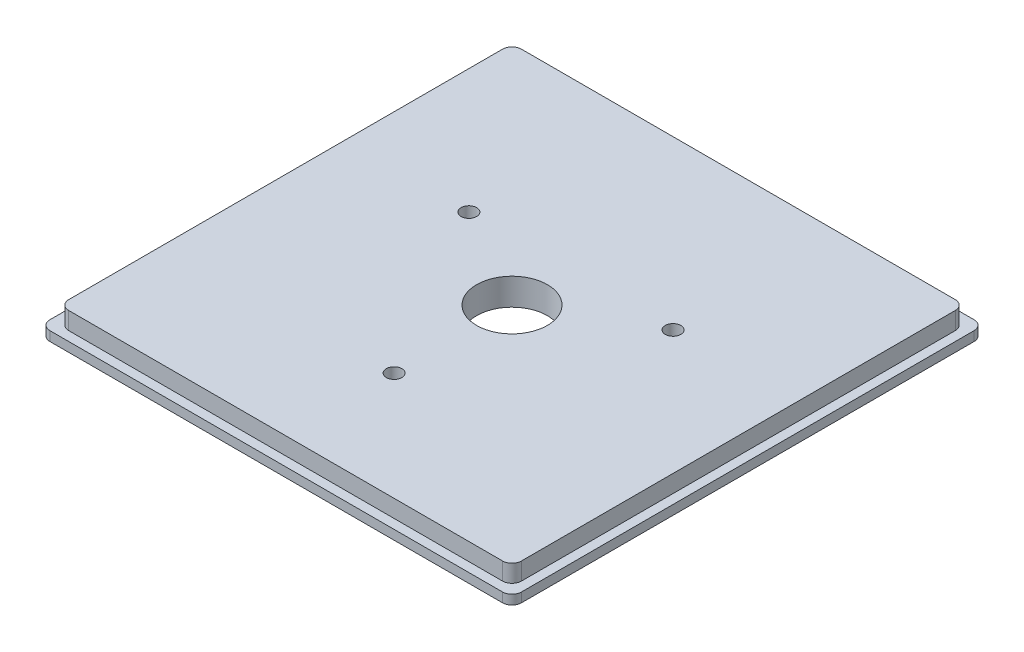
ISO-10303-21;
HEADER;
FILE_DESCRIPTION(('STEP AP214'),'2;1');
FILE_NAME('part.step','',(''),(''),'','','');
FILE_SCHEMA(('AUTOMOTIVE_DESIGN { 1 0 10303 214 1 1 1 1 }'));
ENDSEC;
DATA;
#1=APPLICATION_CONTEXT('core data for automotive mechanical design processes');
#2=APPLICATION_PROTOCOL_DEFINITION('international standard','automotive_design',2000,#1);
#3=PRODUCT_CONTEXT('',#1,'mechanical');
#4=PRODUCT('Part','Part','',(#3));
#5=PRODUCT_RELATED_PRODUCT_CATEGORY('part','',(#4));
#6=PRODUCT_DEFINITION_FORMATION('','',#4);
#7=PRODUCT_DEFINITION_CONTEXT('part definition',#1,'design');
#8=PRODUCT_DEFINITION('design','',#6,#7);
#9=PRODUCT_DEFINITION_SHAPE('','',#8);
#10=(LENGTH_UNIT() NAMED_UNIT(*) SI_UNIT(.MILLI.,.METRE.));
#11=(NAMED_UNIT(*) PLANE_ANGLE_UNIT() SI_UNIT($,.RADIAN.));
#12=(NAMED_UNIT(*) SI_UNIT($,.STERADIAN.) SOLID_ANGLE_UNIT());
#13=UNCERTAINTY_MEASURE_WITH_UNIT(LENGTH_MEASURE(1.E-05),#10,'distance_accuracy_value','');
#14=(GEOMETRIC_REPRESENTATION_CONTEXT(3) GLOBAL_UNCERTAINTY_ASSIGNED_CONTEXT((#13)) GLOBAL_UNIT_ASSIGNED_CONTEXT((#10,
#11,#12)) REPRESENTATION_CONTEXT('',''));
#15=CARTESIAN_POINT('',(0.,0.,0.));
#16=DIRECTION('',(0.,0.,1.));
#17=DIRECTION('',(1.,0.,0.));
#18=AXIS2_PLACEMENT_3D('',#15,#16,#17);
#19=CARTESIAN_POINT('',(0.,2.,0.));
#20=DIRECTION('',(0.,1.,0.));
#21=DIRECTION('',(0.,0.,1.));
#22=AXIS2_PLACEMENT_3D('',#19,#20,#21);
#23=PLANE('',#22);
#24=DIRECTION('',(1.,0.,0.));
#25=VECTOR('',#24,1.);
#26=CARTESIAN_POINT('',(0.,2.,0.));
#27=LINE('',#26,#25);
#28=CARTESIAN_POINT('',(2.,2.,0.));
#29=VERTEX_POINT('',#28);
#30=CARTESIAN_POINT('',(98.,2.,0.));
#31=VERTEX_POINT('',#30);
#32=EDGE_CURVE('E183',#29,#31,#27,.T.);
#33=ORIENTED_EDGE('',*,*,#32,.T.);
#34=CARTESIAN_POINT('',(98.,2.,-2.));
#35=DIRECTION('',(0.,1.,0.));
#36=DIRECTION('',(0.,0.,1.));
#37=AXIS2_PLACEMENT_3D('',#34,#35,#36);
#38=CIRCLE('',#37,2.);
#39=CARTESIAN_POINT('',(100.,2.,-2.));
#40=VERTEX_POINT('',#39);
#41=EDGE_CURVE('E199',#31,#40,#38,.T.);
#42=ORIENTED_EDGE('',*,*,#41,.T.);
#43=DIRECTION('',(0.,0.,-1.));
#44=VECTOR('',#43,1.);
#45=CARTESIAN_POINT('',(100.,2.,0.));
#46=LINE('',#45,#44);
#47=CARTESIAN_POINT('',(100.,2.,-98.));
#48=VERTEX_POINT('',#47);
#49=EDGE_CURVE('E166',#40,#48,#46,.T.);
#50=ORIENTED_EDGE('',*,*,#49,.T.);
#51=CARTESIAN_POINT('',(98.,2.,-98.));
#52=DIRECTION('',(0.,1.,0.));
#53=DIRECTION('',(0.,0.,1.));
#54=AXIS2_PLACEMENT_3D('',#51,#52,#53);
#55=CIRCLE('',#54,2.);
#56=CARTESIAN_POINT('',(98.,2.,-100.));
#57=VERTEX_POINT('',#56);
#58=EDGE_CURVE('E197',#48,#57,#55,.T.);
#59=ORIENTED_EDGE('',*,*,#58,.T.);
#60=DIRECTION('',(1.,0.,0.));
#61=VECTOR('',#60,1.);
#62=CARTESIAN_POINT('',(0.,2.,-100.));
#63=LINE('',#62,#61);
#64=CARTESIAN_POINT('',(2.,2.,-100.));
#65=VERTEX_POINT('',#64);
#66=EDGE_CURVE('E273',#65,#57,#63,.T.);
#67=ORIENTED_EDGE('',*,*,#66,.F.);
#68=CARTESIAN_POINT('',(2.,2.,-98.));
#69=DIRECTION('',(0.,1.,0.));
#70=DIRECTION('',(0.,0.,1.));
#71=AXIS2_PLACEMENT_3D('',#68,#69,#70);
#72=CIRCLE('',#71,2.);
#73=CARTESIAN_POINT('',(0.,2.,-98.));
#74=VERTEX_POINT('',#73);
#75=EDGE_CURVE('E195',#65,#74,#72,.T.);
#76=ORIENTED_EDGE('',*,*,#75,.T.);
#77=DIRECTION('',(0.,0.,-1.));
#78=VECTOR('',#77,1.);
#79=CARTESIAN_POINT('',(0.,2.,0.));
#80=LINE('',#79,#78);
#81=CARTESIAN_POINT('',(0.,2.,-2.));
#82=VERTEX_POINT('',#81);
#83=EDGE_CURVE('E184',#82,#74,#80,.T.);
#84=ORIENTED_EDGE('',*,*,#83,.F.);
#85=CARTESIAN_POINT('',(2.,2.,-2.));
#86=DIRECTION('',(0.,1.,0.));
#87=DIRECTION('',(0.,0.,1.));
#88=AXIS2_PLACEMENT_3D('',#85,#86,#87);
#89=CIRCLE('',#88,2.);
#90=EDGE_CURVE('E193',#82,#29,#89,.T.);
#91=ORIENTED_EDGE('',*,*,#90,.T.);
#92=EDGE_LOOP('',(#33,#42,#50,#59,#67,#76,#84,#91));
#93=FACE_BOUND('',#92,.T.);
#94=DIRECTION('',(-1.,0.,0.));
#95=VECTOR('',#94,1.);
#96=CARTESIAN_POINT('',(0.,2.,-98.));
#97=LINE('',#96,#95);
#98=CARTESIAN_POINT('',(96.,2.,-98.));
#99=VERTEX_POINT('',#98);
#100=CARTESIAN_POINT('',(4.,2.,-98.));
#101=VERTEX_POINT('',#100);
#102=EDGE_CURVE('E244',#99,#101,#97,.T.);
#103=ORIENTED_EDGE('',*,*,#102,.F.);
#104=CARTESIAN_POINT('',(96.,2.,-96.));
#105=DIRECTION('',(0.,1.,0.));
#106=DIRECTION('',(0.,0.,1.));
#107=AXIS2_PLACEMENT_3D('',#104,#105,#106);
#108=CIRCLE('',#107,2.);
#109=CARTESIAN_POINT('',(98.,2.,-96.));
#110=VERTEX_POINT('',#109);
#111=EDGE_CURVE('E239',#99,#110,#108,.F.);
#112=ORIENTED_EDGE('',*,*,#111,.T.);
#113=DIRECTION('',(0.,0.,1.));
#114=VECTOR('',#113,1.);
#115=CARTESIAN_POINT('',(98.,2.,0.));
#116=LINE('',#115,#114);
#117=CARTESIAN_POINT('',(98.,2.,-4.));
#118=VERTEX_POINT('',#117);
#119=EDGE_CURVE('E253',#110,#118,#116,.T.);
#120=ORIENTED_EDGE('',*,*,#119,.T.);
#121=CARTESIAN_POINT('',(96.,2.,-4.));
#122=DIRECTION('',(0.,1.,0.));
#123=DIRECTION('',(0.,0.,1.));
#124=AXIS2_PLACEMENT_3D('',#121,#122,#123);
#125=CIRCLE('',#124,2.);
#126=CARTESIAN_POINT('',(96.,2.,-2.));
#127=VERTEX_POINT('',#126);
#128=EDGE_CURVE('E237',#118,#127,#125,.F.);
#129=ORIENTED_EDGE('',*,*,#128,.T.);
#130=DIRECTION('',(-1.,0.,0.));
#131=VECTOR('',#130,1.);
#132=CARTESIAN_POINT('',(0.,2.,-2.));
#133=LINE('',#132,#131);
#134=CARTESIAN_POINT('',(4.,2.,-2.));
#135=VERTEX_POINT('',#134);
#136=EDGE_CURVE('E177',#127,#135,#133,.T.);
#137=ORIENTED_EDGE('',*,*,#136,.T.);
#138=CARTESIAN_POINT('',(4.,2.,-4.));
#139=DIRECTION('',(0.,1.,0.));
#140=DIRECTION('',(0.,0.,1.));
#141=AXIS2_PLACEMENT_3D('',#138,#139,#140);
#142=CIRCLE('',#141,2.);
#143=CARTESIAN_POINT('',(2.,2.,-4.));
#144=VERTEX_POINT('',#143);
#145=EDGE_CURVE('E11',#135,#144,#142,.F.);
#146=ORIENTED_EDGE('',*,*,#145,.T.);
#147=DIRECTION('',(0.,0.,1.));
#148=VECTOR('',#147,1.);
#149=CARTESIAN_POINT('',(2.,2.,0.));
#150=LINE('',#149,#148);
#151=CARTESIAN_POINT('',(2.,2.,-96.));
#152=VERTEX_POINT('',#151);
#153=EDGE_CURVE('E245',#152,#144,#150,.T.);
#154=ORIENTED_EDGE('',*,*,#153,.F.);
#155=CARTESIAN_POINT('',(4.,2.,-96.));
#156=DIRECTION('',(0.,1.,0.));
#157=DIRECTION('',(0.,0.,1.));
#158=AXIS2_PLACEMENT_3D('',#155,#156,#157);
#159=CIRCLE('',#158,2.);
#160=EDGE_CURVE('E40',#152,#101,#159,.F.);
#161=ORIENTED_EDGE('',*,*,#160,.T.);
#162=EDGE_LOOP('',(#103,#112,#120,#129,#137,#146,#154,#161));
#163=FACE_BOUND('',#162,.T.);
#164=ADVANCED_FACE('F32',(#93,#163),#23,.T.);
#165=CARTESIAN_POINT('',(0.,2.,0.));
#166=DIRECTION('',(0.,0.,-1.));
#167=DIRECTION('',(-1.,0.,0.));
#168=AXIS2_PLACEMENT_3D('',#165,#166,#167);
#169=PLANE('',#168);
#170=DIRECTION('',(1.,0.,0.));
#171=VECTOR('',#170,1.);
#172=CARTESIAN_POINT('',(0.,0.,0.));
#173=LINE('',#172,#171);
#174=CARTESIAN_POINT('',(2.,0.,0.));
#175=VERTEX_POINT('',#174);
#176=CARTESIAN_POINT('',(98.,0.,0.));
#177=VERTEX_POINT('',#176);
#178=EDGE_CURVE('E173',#175,#177,#173,.T.);
#179=ORIENTED_EDGE('',*,*,#178,.T.);
#180=DIRECTION('',(0.,-1.,0.));
#181=VECTOR('',#180,1.);
#182=CARTESIAN_POINT('',(98.,2.,0.));
#183=LINE('',#182,#181);
#184=EDGE_CURVE('E151',#177,#31,#183,.F.);
#185=ORIENTED_EDGE('',*,*,#184,.T.);
#186=ORIENTED_EDGE('',*,*,#32,.F.);
#187=DIRECTION('',(0.,-1.,0.));
#188=VECTOR('',#187,1.);
#189=CARTESIAN_POINT('',(2.,0.,0.));
#190=LINE('',#189,#188);
#191=EDGE_CURVE('E156',#29,#175,#190,.T.);
#192=ORIENTED_EDGE('',*,*,#191,.T.);
#193=EDGE_LOOP('',(#179,#185,#186,#192));
#194=FACE_BOUND('',#193,.T.);
#195=ADVANCED_FACE('F299',(#194),#169,.F.);
#196=CARTESIAN_POINT('',(100.,2.,0.));
#197=DIRECTION('',(-1.,0.,0.));
#198=DIRECTION('',(0.,0.,1.));
#199=AXIS2_PLACEMENT_3D('',#196,#197,#198);
#200=PLANE('',#199);
#201=ORIENTED_EDGE('',*,*,#49,.F.);
#202=DIRECTION('',(0.,-1.,0.));
#203=VECTOR('',#202,1.);
#204=CARTESIAN_POINT('',(100.,2.,-2.));
#205=LINE('',#204,#203);
#206=CARTESIAN_POINT('',(100.,0.,-2.));
#207=VERTEX_POINT('',#206);
#208=EDGE_CURVE('E150',#40,#207,#205,.T.);
#209=ORIENTED_EDGE('',*,*,#208,.T.);
#210=DIRECTION('',(0.,0.,-1.));
#211=VECTOR('',#210,1.);
#212=CARTESIAN_POINT('',(100.,0.,0.));
#213=LINE('',#212,#211);
#214=CARTESIAN_POINT('',(100.,0.,-98.));
#215=VERTEX_POINT('',#214);
#216=EDGE_CURVE('E163',#207,#215,#213,.T.);
#217=ORIENTED_EDGE('',*,*,#216,.T.);
#218=DIRECTION('',(0.,-1.,0.));
#219=VECTOR('',#218,1.);
#220=CARTESIAN_POINT('',(100.,2.,-98.));
#221=LINE('',#220,#219);
#222=EDGE_CURVE('E168',#215,#48,#221,.F.);
#223=ORIENTED_EDGE('',*,*,#222,.T.);
#224=EDGE_LOOP('',(#201,#209,#217,#223));
#225=FACE_BOUND('',#224,.T.);
#226=ADVANCED_FACE('F162',(#225),#200,.F.);
#227=CARTESIAN_POINT('',(0.,2.,-100.));
#228=DIRECTION('',(0.,0.,-1.));
#229=DIRECTION('',(-1.,0.,0.));
#230=AXIS2_PLACEMENT_3D('',#227,#228,#229);
#231=PLANE('',#230);
#232=ORIENTED_EDGE('',*,*,#66,.T.);
#233=DIRECTION('',(0.,-1.,0.));
#234=VECTOR('',#233,1.);
#235=CARTESIAN_POINT('',(98.,0.,-100.));
#236=LINE('',#235,#234);
#237=CARTESIAN_POINT('',(98.,0.,-100.));
#238=VERTEX_POINT('',#237);
#239=EDGE_CURVE('E220',#57,#238,#236,.T.);
#240=ORIENTED_EDGE('',*,*,#239,.T.);
#241=DIRECTION('',(1.,0.,0.));
#242=VECTOR('',#241,1.);
#243=CARTESIAN_POINT('',(0.,0.,-100.));
#244=LINE('',#243,#242);
#245=CARTESIAN_POINT('',(2.,0.,-100.));
#246=VERTEX_POINT('',#245);
#247=EDGE_CURVE('E172',#246,#238,#244,.T.);
#248=ORIENTED_EDGE('',*,*,#247,.F.);
#249=DIRECTION('',(0.,-1.,0.));
#250=VECTOR('',#249,1.);
#251=CARTESIAN_POINT('',(2.,2.,-100.));
#252=LINE('',#251,#250);
#253=EDGE_CURVE('E218',#246,#65,#252,.F.);
#254=ORIENTED_EDGE('',*,*,#253,.T.);
#255=EDGE_LOOP('',(#232,#240,#248,#254));
#256=FACE_BOUND('',#255,.T.);
#257=ADVANCED_FACE('F290',(#256),#231,.T.);
#258=CARTESIAN_POINT('',(0.,2.,0.));
#259=DIRECTION('',(-1.,0.,0.));
#260=DIRECTION('',(0.,0.,1.));
#261=AXIS2_PLACEMENT_3D('',#258,#259,#260);
#262=PLANE('',#261);
#263=ORIENTED_EDGE('',*,*,#83,.T.);
#264=DIRECTION('',(0.,-1.,0.));
#265=VECTOR('',#264,1.);
#266=CARTESIAN_POINT('',(0.,2.,-98.));
#267=LINE('',#266,#265);
#268=CARTESIAN_POINT('',(0.,0.,-98.));
#269=VERTEX_POINT('',#268);
#270=EDGE_CURVE('E230',#74,#269,#267,.T.);
#271=ORIENTED_EDGE('',*,*,#270,.T.);
#272=DIRECTION('',(0.,0.,-1.));
#273=VECTOR('',#272,1.);
#274=CARTESIAN_POINT('',(0.,0.,0.));
#275=LINE('',#274,#273);
#276=CARTESIAN_POINT('',(0.,0.,-2.));
#277=VERTEX_POINT('',#276);
#278=EDGE_CURVE('E175',#277,#269,#275,.T.);
#279=ORIENTED_EDGE('',*,*,#278,.F.);
#280=DIRECTION('',(0.,-1.,0.));
#281=VECTOR('',#280,1.);
#282=CARTESIAN_POINT('',(0.,2.,-2.));
#283=LINE('',#282,#281);
#284=EDGE_CURVE('E228',#277,#82,#283,.F.);
#285=ORIENTED_EDGE('',*,*,#284,.T.);
#286=EDGE_LOOP('',(#263,#271,#279,#285));
#287=FACE_BOUND('',#286,.T.);
#288=ADVANCED_FACE('F279',(#287),#262,.T.);
#289=CARTESIAN_POINT('',(0.,0.,0.));
#290=DIRECTION('',(0.,1.,0.));
#291=DIRECTION('',(0.,0.,1.));
#292=AXIS2_PLACEMENT_3D('',#289,#290,#291);
#293=PLANE('',#292);
#294=CARTESIAN_POINT('',(71.6506350946111,0.,-62.4999999999998));
#295=DIRECTION('',(0.,1.,0.));
#296=DIRECTION('',(0.,0.,1.));
#297=AXIS2_PLACEMENT_3D('',#294,#295,#296);
#298=CIRCLE('',#297,1.64999999999999);
#299=CARTESIAN_POINT('',(71.6506350946111,0.,-60.8499999999998));
#300=VERTEX_POINT('',#299);
#301=EDGE_CURVE('E452',#300,#300,#298,.T.);
#302=ORIENTED_EDGE('',*,*,#301,.T.);
#303=EDGE_LOOP('',(#302));
#304=FACE_BOUND('',#303,.T.);
#305=CARTESIAN_POINT('',(28.3493649053891,0.,-62.5000000000001));
#306=DIRECTION('',(0.,1.,0.));
#307=DIRECTION('',(0.,0.,1.));
#308=AXIS2_PLACEMENT_3D('',#305,#306,#307);
#309=CIRCLE('',#308,1.65000000000001);
#310=CARTESIAN_POINT('',(28.3493649053891,0.,-60.8500000000001));
#311=VERTEX_POINT('',#310);
#312=EDGE_CURVE('E457',#311,#311,#309,.T.);
#313=ORIENTED_EDGE('',*,*,#312,.T.);
#314=EDGE_LOOP('',(#313));
#315=FACE_BOUND('',#314,.T.);
#316=CARTESIAN_POINT('',(50.,0.,-25.));
#317=DIRECTION('',(0.,1.,0.));
#318=DIRECTION('',(0.,0.,1.));
#319=AXIS2_PLACEMENT_3D('',#316,#317,#318);
#320=CIRCLE('',#319,1.65);
#321=CARTESIAN_POINT('',(50.,0.,-23.35));
#322=VERTEX_POINT('',#321);
#323=EDGE_CURVE('E463',#322,#322,#320,.T.);
#324=ORIENTED_EDGE('',*,*,#323,.T.);
#325=EDGE_LOOP('',(#324));
#326=FACE_BOUND('',#325,.T.);
#327=CARTESIAN_POINT('',(50.,0.,-50.));
#328=DIRECTION('',(0.,1.,0.));
#329=DIRECTION('',(0.,0.,1.));
#330=AXIS2_PLACEMENT_3D('',#327,#328,#329);
#331=CIRCLE('',#330,7.5);
#332=CARTESIAN_POINT('',(50.,0.,-42.5));
#333=VERTEX_POINT('',#332);
#334=EDGE_CURVE('E446',#333,#333,#331,.T.);
#335=ORIENTED_EDGE('',*,*,#334,.T.);
#336=EDGE_LOOP('',(#335));
#337=FACE_BOUND('',#336,.T.);
#338=ORIENTED_EDGE('',*,*,#216,.F.);
#339=CARTESIAN_POINT('',(98.,0.,-2.));
#340=DIRECTION('',(0.,1.,0.));
#341=DIRECTION('',(0.,0.,1.));
#342=AXIS2_PLACEMENT_3D('',#339,#340,#341);
#343=CIRCLE('',#342,2.);
#344=EDGE_CURVE('E146',#207,#177,#343,.F.);
#345=ORIENTED_EDGE('',*,*,#344,.T.);
#346=ORIENTED_EDGE('',*,*,#178,.F.);
#347=CARTESIAN_POINT('',(2.,0.,-2.));
#348=DIRECTION('',(0.,1.,0.));
#349=DIRECTION('',(0.,0.,1.));
#350=AXIS2_PLACEMENT_3D('',#347,#348,#349);
#351=CIRCLE('',#350,2.);
#352=EDGE_CURVE('E167',#175,#277,#351,.F.);
#353=ORIENTED_EDGE('',*,*,#352,.T.);
#354=ORIENTED_EDGE('',*,*,#278,.T.);
#355=CARTESIAN_POINT('',(2.,0.,-98.));
#356=DIRECTION('',(0.,1.,0.));
#357=DIRECTION('',(0.,0.,1.));
#358=AXIS2_PLACEMENT_3D('',#355,#356,#357);
#359=CIRCLE('',#358,2.);
#360=EDGE_CURVE('E187',#269,#246,#359,.F.);
#361=ORIENTED_EDGE('',*,*,#360,.T.);
#362=ORIENTED_EDGE('',*,*,#247,.T.);
#363=CARTESIAN_POINT('',(98.,0.,-98.));
#364=DIRECTION('',(0.,1.,0.));
#365=DIRECTION('',(0.,0.,1.));
#366=AXIS2_PLACEMENT_3D('',#363,#364,#365);
#367=CIRCLE('',#366,2.);
#368=EDGE_CURVE('E157',#238,#215,#367,.F.);
#369=ORIENTED_EDGE('',*,*,#368,.T.);
#370=EDGE_LOOP('',(#338,#345,#346,#353,#354,#361,#362,#369));
#371=FACE_BOUND('',#370,.T.);
#372=ADVANCED_FACE('F170',(#304,#315,#326,#337,#371),#293,.F.);
#373=CARTESIAN_POINT('',(2.,5.7,-2.));
#374=DIRECTION('',(0.,0.,-1.));
#375=DIRECTION('',(-1.,0.,0.));
#376=AXIS2_PLACEMENT_3D('',#373,#374,#375);
#377=PLANE('',#376);
#378=ORIENTED_EDGE('',*,*,#136,.F.);
#379=DIRECTION('',(0.,-1.,0.));
#380=VECTOR('',#379,1.);
#381=CARTESIAN_POINT('',(96.,5.7,-2.));
#382=LINE('',#381,#380);
#383=CARTESIAN_POINT('',(96.,5.7,-2.));
#384=VERTEX_POINT('',#383);
#385=EDGE_CURVE('E209',#127,#384,#382,.F.);
#386=ORIENTED_EDGE('',*,*,#385,.T.);
#387=DIRECTION('',(1.,0.,0.));
#388=VECTOR('',#387,1.);
#389=CARTESIAN_POINT('',(2.,5.7,-2.));
#390=LINE('',#389,#388);
#391=CARTESIAN_POINT('',(4.,5.7,-2.));
#392=VERTEX_POINT('',#391);
#393=EDGE_CURVE('E436',#392,#384,#390,.T.);
#394=ORIENTED_EDGE('',*,*,#393,.F.);
#395=DIRECTION('',(0.,-1.,0.));
#396=VECTOR('',#395,1.);
#397=CARTESIAN_POINT('',(4.,2.,-2.));
#398=LINE('',#397,#396);
#399=EDGE_CURVE('E206',#392,#135,#398,.T.);
#400=ORIENTED_EDGE('',*,*,#399,.T.);
#401=EDGE_LOOP('',(#378,#386,#394,#400));
#402=FACE_BOUND('',#401,.T.);
#403=ADVANCED_FACE('F320',(#402),#377,.F.);
#404=CARTESIAN_POINT('',(98.,5.7,-2.));
#405=DIRECTION('',(-1.,0.,0.));
#406=DIRECTION('',(0.,0.,1.));
#407=AXIS2_PLACEMENT_3D('',#404,#405,#406);
#408=PLANE('',#407);
#409=DIRECTION('',(0.,0.,-1.));
#410=VECTOR('',#409,1.);
#411=CARTESIAN_POINT('',(98.,5.7,-2.));
#412=LINE('',#411,#410);
#413=CARTESIAN_POINT('',(98.,5.7,-4.));
#414=VERTEX_POINT('',#413);
#415=CARTESIAN_POINT('',(98.,5.7,-96.));
#416=VERTEX_POINT('',#415);
#417=EDGE_CURVE('E262',#414,#416,#412,.T.);
#418=ORIENTED_EDGE('',*,*,#417,.F.);
#419=DIRECTION('',(0.,-1.,0.));
#420=VECTOR('',#419,1.);
#421=CARTESIAN_POINT('',(98.,5.7,-4.));
#422=LINE('',#421,#420);
#423=EDGE_CURVE('E203',#414,#118,#422,.T.);
#424=ORIENTED_EDGE('',*,*,#423,.T.);
#425=ORIENTED_EDGE('',*,*,#119,.F.);
#426=DIRECTION('',(0.,-1.,0.));
#427=VECTOR('',#426,1.);
#428=CARTESIAN_POINT('',(98.,5.7,-96.));
#429=LINE('',#428,#427);
#430=EDGE_CURVE('E201',#110,#416,#429,.F.);
#431=ORIENTED_EDGE('',*,*,#430,.T.);
#432=EDGE_LOOP('',(#418,#424,#425,#431));
#433=FACE_BOUND('',#432,.T.);
#434=ADVANCED_FACE('F424',(#433),#408,.F.);
#435=CARTESIAN_POINT('',(2.,5.7,-98.));
#436=DIRECTION('',(0.,0.,-1.));
#437=DIRECTION('',(-1.,0.,0.));
#438=AXIS2_PLACEMENT_3D('',#435,#436,#437);
#439=PLANE('',#438);
#440=DIRECTION('',(1.,0.,0.));
#441=VECTOR('',#440,1.);
#442=CARTESIAN_POINT('',(2.,5.7,-98.));
#443=LINE('',#442,#441);
#444=CARTESIAN_POINT('',(4.,5.7,-98.));
#445=VERTEX_POINT('',#444);
#446=CARTESIAN_POINT('',(96.,5.7,-98.));
#447=VERTEX_POINT('',#446);
#448=EDGE_CURVE('E259',#445,#447,#443,.T.);
#449=ORIENTED_EDGE('',*,*,#448,.T.);
#450=DIRECTION('',(0.,-1.,0.));
#451=VECTOR('',#450,1.);
#452=CARTESIAN_POINT('',(96.,2.,-98.));
#453=LINE('',#452,#451);
#454=EDGE_CURVE('E225',#447,#99,#453,.T.);
#455=ORIENTED_EDGE('',*,*,#454,.T.);
#456=ORIENTED_EDGE('',*,*,#102,.T.);
#457=DIRECTION('',(0.,-1.,0.));
#458=VECTOR('',#457,1.);
#459=CARTESIAN_POINT('',(4.,5.7,-98.));
#460=LINE('',#459,#458);
#461=EDGE_CURVE('E223',#101,#445,#460,.F.);
#462=ORIENTED_EDGE('',*,*,#461,.T.);
#463=EDGE_LOOP('',(#449,#455,#456,#462));
#464=FACE_BOUND('',#463,.T.);
#465=ADVANCED_FACE('F251',(#464),#439,.T.);
#466=CARTESIAN_POINT('',(2.,5.7,-2.));
#467=DIRECTION('',(-1.,0.,0.));
#468=DIRECTION('',(0.,0.,1.));
#469=AXIS2_PLACEMENT_3D('',#466,#467,#468);
#470=PLANE('',#469);
#471=DIRECTION('',(0.,0.,-1.));
#472=VECTOR('',#471,1.);
#473=CARTESIAN_POINT('',(2.,5.7,-2.));
#474=LINE('',#473,#472);
#475=CARTESIAN_POINT('',(2.,5.7,-4.));
#476=VERTEX_POINT('',#475);
#477=CARTESIAN_POINT('',(2.,5.7,-96.));
#478=VERTEX_POINT('',#477);
#479=EDGE_CURVE('E257',#476,#478,#474,.T.);
#480=ORIENTED_EDGE('',*,*,#479,.T.);
#481=DIRECTION('',(0.,-1.,0.));
#482=VECTOR('',#481,1.);
#483=CARTESIAN_POINT('',(2.,5.7,-96.));
#484=LINE('',#483,#482);
#485=EDGE_CURVE('E234',#478,#152,#484,.T.);
#486=ORIENTED_EDGE('',*,*,#485,.T.);
#487=ORIENTED_EDGE('',*,*,#153,.T.);
#488=DIRECTION('',(0.,-1.,0.));
#489=VECTOR('',#488,1.);
#490=CARTESIAN_POINT('',(2.,5.7,-4.));
#491=LINE('',#490,#489);
#492=EDGE_CURVE('E54',#144,#476,#491,.F.);
#493=ORIENTED_EDGE('',*,*,#492,.T.);
#494=EDGE_LOOP('',(#480,#486,#487,#493));
#495=FACE_BOUND('',#494,.T.);
#496=ADVANCED_FACE('F256',(#495),#470,.T.);
#497=CARTESIAN_POINT('',(0.,5.7,0.));
#498=DIRECTION('',(0.,1.,0.));
#499=DIRECTION('',(0.,0.,1.));
#500=AXIS2_PLACEMENT_3D('',#497,#498,#499);
#501=PLANE('',#500);
#502=CARTESIAN_POINT('',(71.6506350946111,5.7,-62.4999999999998));
#503=DIRECTION('',(0.,1.,0.));
#504=DIRECTION('',(0.,0.,1.));
#505=AXIS2_PLACEMENT_3D('',#502,#503,#504);
#506=CIRCLE('',#505,1.64999999999999);
#507=CARTESIAN_POINT('',(71.6506350946111,5.7,-60.8499999999998));
#508=VERTEX_POINT('',#507);
#509=EDGE_CURVE('E455',#508,#508,#506,.T.);
#510=ORIENTED_EDGE('',*,*,#509,.F.);
#511=EDGE_LOOP('',(#510));
#512=FACE_BOUND('',#511,.T.);
#513=CARTESIAN_POINT('',(28.3493649053891,5.7,-62.5000000000001));
#514=DIRECTION('',(0.,1.,0.));
#515=DIRECTION('',(0.,0.,1.));
#516=AXIS2_PLACEMENT_3D('',#513,#514,#515);
#517=CIRCLE('',#516,1.65000000000001);
#518=CARTESIAN_POINT('',(28.3493649053891,5.7,-60.8500000000001));
#519=VERTEX_POINT('',#518);
#520=EDGE_CURVE('E460',#519,#519,#517,.T.);
#521=ORIENTED_EDGE('',*,*,#520,.F.);
#522=EDGE_LOOP('',(#521));
#523=FACE_BOUND('',#522,.T.);
#524=CARTESIAN_POINT('',(50.,5.7,-25.));
#525=DIRECTION('',(0.,1.,0.));
#526=DIRECTION('',(0.,0.,1.));
#527=AXIS2_PLACEMENT_3D('',#524,#525,#526);
#528=CIRCLE('',#527,1.65);
#529=CARTESIAN_POINT('',(50.,5.7,-23.35));
#530=VERTEX_POINT('',#529);
#531=EDGE_CURVE('E450',#530,#530,#528,.T.);
#532=ORIENTED_EDGE('',*,*,#531,.F.);
#533=EDGE_LOOP('',(#532));
#534=FACE_BOUND('',#533,.T.);
#535=CARTESIAN_POINT('',(50.,5.7,-50.));
#536=DIRECTION('',(0.,1.,0.));
#537=DIRECTION('',(0.,0.,1.));
#538=AXIS2_PLACEMENT_3D('',#535,#536,#537);
#539=CIRCLE('',#538,7.5);
#540=CARTESIAN_POINT('',(50.,5.7,-42.5));
#541=VERTEX_POINT('',#540);
#542=EDGE_CURVE('E443',#541,#541,#539,.T.);
#543=ORIENTED_EDGE('',*,*,#542,.F.);
#544=EDGE_LOOP('',(#543));
#545=FACE_BOUND('',#544,.T.);
#546=ORIENTED_EDGE('',*,*,#393,.T.);
#547=CARTESIAN_POINT('',(96.,5.7,-4.));
#548=DIRECTION('',(0.,1.,0.));
#549=DIRECTION('',(0.,0.,1.));
#550=AXIS2_PLACEMENT_3D('',#547,#548,#549);
#551=CIRCLE('',#550,2.);
#552=EDGE_CURVE('E216',#384,#414,#551,.T.);
#553=ORIENTED_EDGE('',*,*,#552,.T.);
#554=ORIENTED_EDGE('',*,*,#417,.T.);
#555=CARTESIAN_POINT('',(96.,5.7,-96.));
#556=DIRECTION('',(0.,1.,0.));
#557=DIRECTION('',(0.,0.,1.));
#558=AXIS2_PLACEMENT_3D('',#555,#556,#557);
#559=CIRCLE('',#558,2.);
#560=EDGE_CURVE('E214',#416,#447,#559,.T.);
#561=ORIENTED_EDGE('',*,*,#560,.T.);
#562=ORIENTED_EDGE('',*,*,#448,.F.);
#563=CARTESIAN_POINT('',(4.,5.7,-96.));
#564=DIRECTION('',(0.,1.,0.));
#565=DIRECTION('',(0.,0.,1.));
#566=AXIS2_PLACEMENT_3D('',#563,#564,#565);
#567=CIRCLE('',#566,2.);
#568=EDGE_CURVE('E47',#445,#478,#567,.T.);
#569=ORIENTED_EDGE('',*,*,#568,.T.);
#570=ORIENTED_EDGE('',*,*,#479,.F.);
#571=CARTESIAN_POINT('',(4.,5.7,-4.));
#572=DIRECTION('',(0.,1.,0.));
#573=DIRECTION('',(0.,0.,1.));
#574=AXIS2_PLACEMENT_3D('',#571,#572,#573);
#575=CIRCLE('',#574,2.);
#576=EDGE_CURVE('E211',#476,#392,#575,.T.);
#577=ORIENTED_EDGE('',*,*,#576,.T.);
#578=EDGE_LOOP('',(#546,#553,#554,#561,#562,#569,#570,#577));
#579=FACE_BOUND('',#578,.T.);
#580=ADVANCED_FACE('F334',(#512,#523,#534,#545,#579),#501,.T.);
#581=CARTESIAN_POINT('',(98.,2.,-2.));
#582=DIRECTION('',(0.,-1.,0.));
#583=DIRECTION('',(0.,0.,-1.));
#584=AXIS2_PLACEMENT_3D('',#581,#582,#583);
#585=CYLINDRICAL_SURFACE('',#584,2.);
#586=ORIENTED_EDGE('',*,*,#41,.F.);
#587=ORIENTED_EDGE('',*,*,#184,.F.);
#588=ORIENTED_EDGE('',*,*,#344,.F.);
#589=ORIENTED_EDGE('',*,*,#208,.F.);
#590=EDGE_LOOP('',(#586,#587,#588,#589));
#591=FACE_BOUND('',#590,.T.);
#592=ADVANCED_FACE('F149',(#591),#585,.T.);
#593=CARTESIAN_POINT('',(96.,5.7,-4.));
#594=DIRECTION('',(0.,-1.,0.));
#595=DIRECTION('',(0.,0.,-1.));
#596=AXIS2_PLACEMENT_3D('',#593,#594,#595);
#597=CYLINDRICAL_SURFACE('',#596,2.);
#598=ORIENTED_EDGE('',*,*,#552,.F.);
#599=ORIENTED_EDGE('',*,*,#385,.F.);
#600=ORIENTED_EDGE('',*,*,#128,.F.);
#601=ORIENTED_EDGE('',*,*,#423,.F.);
#602=EDGE_LOOP('',(#598,#599,#600,#601));
#603=FACE_BOUND('',#602,.T.);
#604=ADVANCED_FACE('F333',(#603),#597,.T.);
#605=CARTESIAN_POINT('',(98.,2.,-98.));
#606=DIRECTION('',(0.,1.,0.));
#607=DIRECTION('',(0.,0.,1.));
#608=AXIS2_PLACEMENT_3D('',#605,#606,#607);
#609=CYLINDRICAL_SURFACE('',#608,2.);
#610=ORIENTED_EDGE('',*,*,#58,.F.);
#611=ORIENTED_EDGE('',*,*,#222,.F.);
#612=ORIENTED_EDGE('',*,*,#368,.F.);
#613=ORIENTED_EDGE('',*,*,#239,.F.);
#614=EDGE_LOOP('',(#610,#611,#612,#613));
#615=FACE_BOUND('',#614,.T.);
#616=ADVANCED_FACE('F295',(#615),#609,.T.);
#617=CARTESIAN_POINT('',(96.,5.7,-96.));
#618=DIRECTION('',(0.,1.,0.));
#619=DIRECTION('',(0.,0.,1.));
#620=AXIS2_PLACEMENT_3D('',#617,#618,#619);
#621=CYLINDRICAL_SURFACE('',#620,2.);
#622=ORIENTED_EDGE('',*,*,#560,.F.);
#623=ORIENTED_EDGE('',*,*,#430,.F.);
#624=ORIENTED_EDGE('',*,*,#111,.F.);
#625=ORIENTED_EDGE('',*,*,#454,.F.);
#626=EDGE_LOOP('',(#622,#623,#624,#625));
#627=FACE_BOUND('',#626,.T.);
#628=ADVANCED_FACE('F340',(#627),#621,.T.);
#629=CARTESIAN_POINT('',(2.,2.,-98.));
#630=DIRECTION('',(0.,-1.,0.));
#631=DIRECTION('',(0.,0.,-1.));
#632=AXIS2_PLACEMENT_3D('',#629,#630,#631);
#633=CYLINDRICAL_SURFACE('',#632,2.);
#634=ORIENTED_EDGE('',*,*,#75,.F.);
#635=ORIENTED_EDGE('',*,*,#253,.F.);
#636=ORIENTED_EDGE('',*,*,#360,.F.);
#637=ORIENTED_EDGE('',*,*,#270,.F.);
#638=EDGE_LOOP('',(#634,#635,#636,#637));
#639=FACE_BOUND('',#638,.T.);
#640=ADVANCED_FACE('F286',(#639),#633,.T.);
#641=CARTESIAN_POINT('',(4.,5.7,-96.));
#642=DIRECTION('',(0.,-1.,0.));
#643=DIRECTION('',(0.,0.,-1.));
#644=AXIS2_PLACEMENT_3D('',#641,#642,#643);
#645=CYLINDRICAL_SURFACE('',#644,2.);
#646=ORIENTED_EDGE('',*,*,#568,.F.);
#647=ORIENTED_EDGE('',*,*,#461,.F.);
#648=ORIENTED_EDGE('',*,*,#160,.F.);
#649=ORIENTED_EDGE('',*,*,#485,.F.);
#650=EDGE_LOOP('',(#646,#647,#648,#649));
#651=FACE_BOUND('',#650,.T.);
#652=ADVANCED_FACE('F255',(#651),#645,.T.);
#653=CARTESIAN_POINT('',(4.,5.7,-4.));
#654=DIRECTION('',(0.,1.,0.));
#655=DIRECTION('',(0.,0.,1.));
#656=AXIS2_PLACEMENT_3D('',#653,#654,#655);
#657=CYLINDRICAL_SURFACE('',#656,2.);
#658=ORIENTED_EDGE('',*,*,#576,.F.);
#659=ORIENTED_EDGE('',*,*,#492,.F.);
#660=ORIENTED_EDGE('',*,*,#145,.F.);
#661=ORIENTED_EDGE('',*,*,#399,.F.);
#662=EDGE_LOOP('',(#658,#659,#660,#661));
#663=FACE_BOUND('',#662,.T.);
#664=ADVANCED_FACE('F303',(#663),#657,.T.);
#665=CARTESIAN_POINT('',(2.,2.,-2.));
#666=DIRECTION('',(0.,1.,0.));
#667=DIRECTION('',(0.,0.,1.));
#668=AXIS2_PLACEMENT_3D('',#665,#666,#667);
#669=CYLINDRICAL_SURFACE('',#668,2.);
#670=ORIENTED_EDGE('',*,*,#90,.F.);
#671=ORIENTED_EDGE('',*,*,#284,.F.);
#672=ORIENTED_EDGE('',*,*,#352,.F.);
#673=ORIENTED_EDGE('',*,*,#191,.F.);
#674=EDGE_LOOP('',(#670,#671,#672,#673));
#675=FACE_BOUND('',#674,.T.);
#676=ADVANCED_FACE('F34',(#675),#669,.T.);
#677=CARTESIAN_POINT('',(50.,5.7,-50.));
#678=DIRECTION('',(0.,-1.,0.));
#679=DIRECTION('',(0.,0.,-1.));
#680=AXIS2_PLACEMENT_3D('',#677,#678,#679);
#681=CYLINDRICAL_SURFACE('',#680,7.5);
#682=ORIENTED_EDGE('',*,*,#542,.T.);
#683=EDGE_LOOP('',(#682));
#684=FACE_BOUND('',#683,.T.);
#685=ORIENTED_EDGE('',*,*,#334,.F.);
#686=EDGE_LOOP('',(#685));
#687=FACE_BOUND('',#686,.T.);
#688=ADVANCED_FACE('F302',(#684,#687),#681,.F.);
#689=CARTESIAN_POINT('',(50.,5.7,-25.));
#690=DIRECTION('',(0.,-1.,0.));
#691=DIRECTION('',(0.,0.,-1.));
#692=AXIS2_PLACEMENT_3D('',#689,#690,#691);
#693=CYLINDRICAL_SURFACE('',#692,1.65);
#694=ORIENTED_EDGE('',*,*,#531,.T.);
#695=EDGE_LOOP('',(#694));
#696=FACE_BOUND('',#695,.T.);
#697=ORIENTED_EDGE('',*,*,#323,.F.);
#698=EDGE_LOOP('',(#697));
#699=FACE_BOUND('',#698,.T.);
#700=ADVANCED_FACE('F308',(#696,#699),#693,.F.);
#701=CARTESIAN_POINT('',(28.3493649053891,5.7,-62.5000000000001));
#702=DIRECTION('',(0.,-1.,0.));
#703=DIRECTION('',(0.,0.,-1.));
#704=AXIS2_PLACEMENT_3D('',#701,#702,#703);
#705=CYLINDRICAL_SURFACE('',#704,1.65000000000001);
#706=ORIENTED_EDGE('',*,*,#520,.T.);
#707=EDGE_LOOP('',(#706));
#708=FACE_BOUND('',#707,.T.);
#709=ORIENTED_EDGE('',*,*,#312,.F.);
#710=EDGE_LOOP('',(#709));
#711=FACE_BOUND('',#710,.T.);
#712=ADVANCED_FACE('F395',(#708,#711),#705,.F.);
#713=CARTESIAN_POINT('',(71.6506350946111,5.7,-62.4999999999998));
#714=DIRECTION('',(0.,-1.,0.));
#715=DIRECTION('',(0.,0.,-1.));
#716=AXIS2_PLACEMENT_3D('',#713,#714,#715);
#717=CYLINDRICAL_SURFACE('',#716,1.64999999999999);
#718=ORIENTED_EDGE('',*,*,#509,.T.);
#719=EDGE_LOOP('',(#718));
#720=FACE_BOUND('',#719,.T.);
#721=ORIENTED_EDGE('',*,*,#301,.F.);
#722=EDGE_LOOP('',(#721));
#723=FACE_BOUND('',#722,.T.);
#724=ADVANCED_FACE('F405',(#720,#723),#717,.F.);
#725=CLOSED_SHELL('',(#164,#195,#226,#257,#288,#372,#403,#434,#465,#496,#580,#592,#604,#616,
#628,#640,#652,#664,#676,#688,#700,#712,#724));
#726=MANIFOLD_SOLID_BREP('B2',#725);
#727=ADVANCED_BREP_SHAPE_REPRESENTATION('',(#18,#726),#14);
#728=SHAPE_DEFINITION_REPRESENTATION(#9,#727);
ENDSEC;
END-ISO-10303-21;
